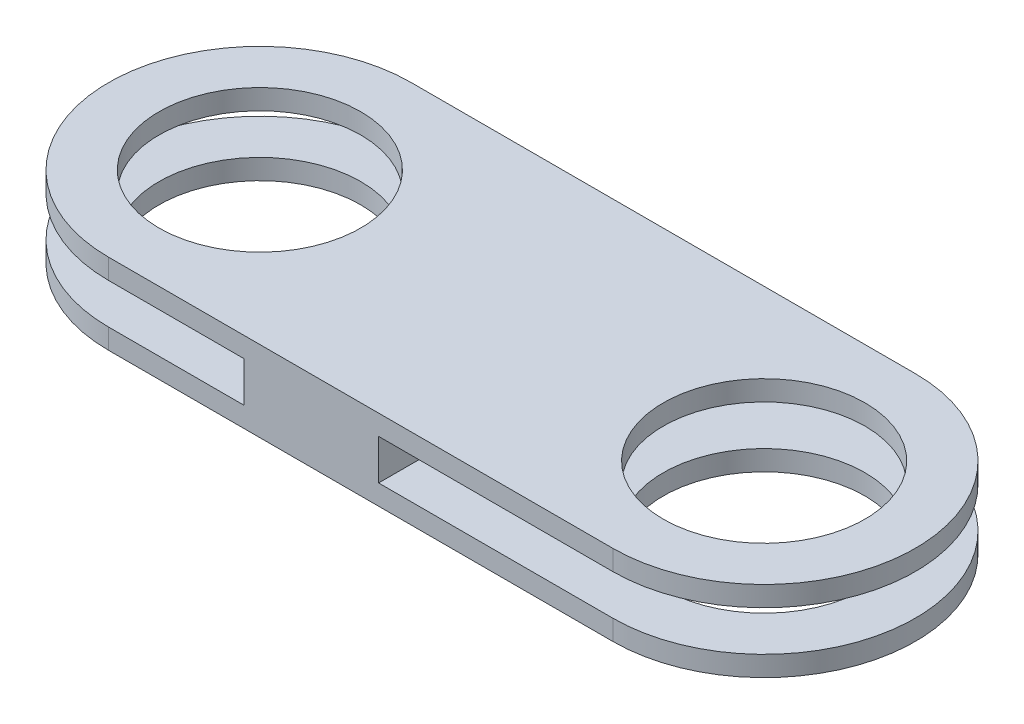
ISO-10303-21;
HEADER;
FILE_DESCRIPTION(('STEP AP214'),'2;1');
FILE_NAME('part.step','',(''),(''),'','','');
FILE_SCHEMA(('AUTOMOTIVE_DESIGN { 1 0 10303 214 1 1 1 1 }'));
ENDSEC;
DATA;
#1=APPLICATION_CONTEXT('core data for automotive mechanical design processes');
#2=APPLICATION_PROTOCOL_DEFINITION('international standard','automotive_design',2000,#1);
#3=PRODUCT_CONTEXT('',#1,'mechanical');
#4=PRODUCT('Part','Part','',(#3));
#5=PRODUCT_RELATED_PRODUCT_CATEGORY('part','',(#4));
#6=PRODUCT_DEFINITION_FORMATION('','',#4);
#7=PRODUCT_DEFINITION_CONTEXT('part definition',#1,'design');
#8=PRODUCT_DEFINITION('design','',#6,#7);
#9=PRODUCT_DEFINITION_SHAPE('','',#8);
#10=(LENGTH_UNIT() NAMED_UNIT(*) SI_UNIT(.MILLI.,.METRE.));
#11=(NAMED_UNIT(*) PLANE_ANGLE_UNIT() SI_UNIT($,.RADIAN.));
#12=(NAMED_UNIT(*) SI_UNIT($,.STERADIAN.) SOLID_ANGLE_UNIT());
#13=UNCERTAINTY_MEASURE_WITH_UNIT(LENGTH_MEASURE(1.E-05),#10,'distance_accuracy_value','');
#14=(GEOMETRIC_REPRESENTATION_CONTEXT(3) GLOBAL_UNCERTAINTY_ASSIGNED_CONTEXT((#13)) GLOBAL_UNIT_ASSIGNED_CONTEXT((#10,
#11,#12)) REPRESENTATION_CONTEXT('',''));
#15=CARTESIAN_POINT('',(0.,0.,0.));
#16=DIRECTION('',(0.,0.,1.));
#17=DIRECTION('',(1.,0.,0.));
#18=AXIS2_PLACEMENT_3D('',#15,#16,#17);
#19=CARTESIAN_POINT('',(0.,2.,0.));
#20=DIRECTION('',(0.,1.,0.));
#21=DIRECTION('',(0.,0.,1.));
#22=AXIS2_PLACEMENT_3D('',#19,#20,#21);
#23=PLANE('',#22);
#24=DIRECTION('',(0.,0.,-1.));
#25=VECTOR('',#24,1.);
#26=CARTESIAN_POINT('',(26.7759105212796,2.,-15.));
#27=LINE('',#26,#25);
#28=CARTESIAN_POINT('',(26.7759105212796,2.,15.));
#29=VERTEX_POINT('',#28);
#30=CARTESIAN_POINT('',(26.7759105212796,2.,-15.));
#31=VERTEX_POINT('',#30);
#32=EDGE_CURVE('E198',#29,#31,#27,.T.);
#33=ORIENTED_EDGE('',*,*,#32,.F.);
#34=DIRECTION('',(1.,0.,0.));
#35=VECTOR('',#34,1.);
#36=CARTESIAN_POINT('',(0.,2.,15.));
#37=LINE('',#36,#35);
#38=CARTESIAN_POINT('',(50.,2.,15.));
#39=VERTEX_POINT('',#38);
#40=EDGE_CURVE('E223',#29,#39,#37,.T.);
#41=ORIENTED_EDGE('',*,*,#40,.T.);
#42=CARTESIAN_POINT('',(50.,2.,0.));
#43=DIRECTION('',(0.,1.,0.));
#44=DIRECTION('',(0.,0.,1.));
#45=AXIS2_PLACEMENT_3D('',#42,#43,#44);
#46=CIRCLE('',#45,15.);
#47=CARTESIAN_POINT('',(50.,2.,-15.));
#48=VERTEX_POINT('',#47);
#49=EDGE_CURVE('E227',#39,#48,#46,.T.);
#50=ORIENTED_EDGE('',*,*,#49,.T.);
#51=DIRECTION('',(-1.,0.,0.));
#52=VECTOR('',#51,1.);
#53=CARTESIAN_POINT('',(0.,2.,-15.));
#54=LINE('',#53,#52);
#55=EDGE_CURVE('E63',#48,#31,#54,.T.);
#56=ORIENTED_EDGE('',*,*,#55,.T.);
#57=EDGE_LOOP('',(#33,#41,#50,#56));
#58=FACE_BOUND('',#57,.T.);
#59=CARTESIAN_POINT('',(50.,2.,0.));
#60=DIRECTION('',(0.,1.,0.));
#61=DIRECTION('',(0.,0.,1.));
#62=AXIS2_PLACEMENT_3D('',#59,#60,#61);
#63=CIRCLE('',#62,9.99999999999999);
#64=CARTESIAN_POINT('',(50.,2.,9.99999999999999));
#65=VERTEX_POINT('',#64);
#66=EDGE_CURVE('E214',#65,#65,#63,.T.);
#67=ORIENTED_EDGE('',*,*,#66,.F.);
#68=EDGE_LOOP('',(#67));
#69=FACE_BOUND('',#68,.T.);
#70=ADVANCED_FACE('F40',(#58,#69),#23,.T.);
#71=DIRECTION('',(0.,0.,1.));
#72=VECTOR('',#71,1.);
#73=CARTESIAN_POINT('',(13.4192062344069,2.,-15.));
#74=LINE('',#73,#72);
#75=CARTESIAN_POINT('',(13.4192062344069,2.,-15.));
#76=VERTEX_POINT('',#75);
#77=CARTESIAN_POINT('',(13.4192062344069,2.,15.));
#78=VERTEX_POINT('',#77);
#79=EDGE_CURVE('E55',#76,#78,#74,.T.);
#80=ORIENTED_EDGE('',*,*,#79,.F.);
#81=CARTESIAN_POINT('',(0.,2.,-15.));
#82=VERTEX_POINT('',#81);
#83=EDGE_CURVE('E229',#76,#82,#54,.T.);
#84=ORIENTED_EDGE('',*,*,#83,.T.);
#85=CARTESIAN_POINT('',(0.,2.,0.));
#86=DIRECTION('',(0.,1.,0.));
#87=DIRECTION('',(0.,0.,1.));
#88=AXIS2_PLACEMENT_3D('',#85,#86,#87);
#89=CIRCLE('',#88,15.);
#90=CARTESIAN_POINT('',(0.,2.,15.));
#91=VERTEX_POINT('',#90);
#92=EDGE_CURVE('E220',#82,#91,#89,.T.);
#93=ORIENTED_EDGE('',*,*,#92,.T.);
#94=EDGE_CURVE('E225',#91,#78,#37,.T.);
#95=ORIENTED_EDGE('',*,*,#94,.T.);
#96=EDGE_LOOP('',(#80,#84,#93,#95));
#97=FACE_BOUND('',#96,.T.);
#98=CARTESIAN_POINT('',(0.,2.,0.));
#99=DIRECTION('',(0.,1.,0.));
#100=DIRECTION('',(0.,0.,1.));
#101=AXIS2_PLACEMENT_3D('',#98,#99,#100);
#102=CIRCLE('',#101,10.);
#103=CARTESIAN_POINT('',(0.,2.,10.));
#104=VERTEX_POINT('',#103);
#105=EDGE_CURVE('E208',#104,#104,#102,.T.);
#106=ORIENTED_EDGE('',*,*,#105,.F.);
#107=EDGE_LOOP('',(#106));
#108=FACE_BOUND('',#107,.T.);
#109=ADVANCED_FACE('F262',(#97,#108),#23,.T.);
#110=CARTESIAN_POINT('',(0.,0.,0.));
#111=DIRECTION('',(0.,1.,0.));
#112=DIRECTION('',(0.,0.,1.));
#113=AXIS2_PLACEMENT_3D('',#110,#111,#112);
#114=PLANE('',#113);
#115=CARTESIAN_POINT('',(0.,0.,0.));
#116=DIRECTION('',(0.,1.,0.));
#117=DIRECTION('',(0.,0.,1.));
#118=AXIS2_PLACEMENT_3D('',#115,#116,#117);
#119=CIRCLE('',#118,15.);
#120=CARTESIAN_POINT('',(0.,0.,-15.));
#121=VERTEX_POINT('',#120);
#122=CARTESIAN_POINT('',(0.,0.,15.));
#123=VERTEX_POINT('',#122);
#124=EDGE_CURVE('E217',#121,#123,#119,.T.);
#125=ORIENTED_EDGE('',*,*,#124,.F.);
#126=DIRECTION('',(-1.,0.,0.));
#127=VECTOR('',#126,1.);
#128=CARTESIAN_POINT('',(0.,0.,-15.));
#129=LINE('',#128,#127);
#130=CARTESIAN_POINT('',(50.,0.,-15.));
#131=VERTEX_POINT('',#130);
#132=EDGE_CURVE('E224',#131,#121,#129,.T.);
#133=ORIENTED_EDGE('',*,*,#132,.F.);
#134=CARTESIAN_POINT('',(50.,0.,0.));
#135=DIRECTION('',(0.,1.,0.));
#136=DIRECTION('',(0.,0.,1.));
#137=AXIS2_PLACEMENT_3D('',#134,#135,#136);
#138=CIRCLE('',#137,15.);
#139=CARTESIAN_POINT('',(50.,0.,15.));
#140=VERTEX_POINT('',#139);
#141=EDGE_CURVE('E236',#140,#131,#138,.T.);
#142=ORIENTED_EDGE('',*,*,#141,.F.);
#143=DIRECTION('',(1.,0.,0.));
#144=VECTOR('',#143,1.);
#145=CARTESIAN_POINT('',(0.,0.,15.));
#146=LINE('',#145,#144);
#147=EDGE_CURVE('E234',#123,#140,#146,.T.);
#148=ORIENTED_EDGE('',*,*,#147,.F.);
#149=EDGE_LOOP('',(#125,#133,#142,#148));
#150=FACE_BOUND('',#149,.T.);
#151=CARTESIAN_POINT('',(50.,0.,0.));
#152=DIRECTION('',(0.,1.,0.));
#153=DIRECTION('',(0.,0.,1.));
#154=AXIS2_PLACEMENT_3D('',#151,#152,#153);
#155=CIRCLE('',#154,9.99999999999999);
#156=CARTESIAN_POINT('',(50.,0.,9.99999999999999));
#157=VERTEX_POINT('',#156);
#158=EDGE_CURVE('E211',#157,#157,#155,.T.);
#159=ORIENTED_EDGE('',*,*,#158,.T.);
#160=EDGE_LOOP('',(#159));
#161=FACE_BOUND('',#160,.T.);
#162=CARTESIAN_POINT('',(0.,0.,0.));
#163=DIRECTION('',(0.,1.,0.));
#164=DIRECTION('',(0.,0.,1.));
#165=AXIS2_PLACEMENT_3D('',#162,#163,#164);
#166=CIRCLE('',#165,10.);
#167=CARTESIAN_POINT('',(0.,0.,10.));
#168=VERTEX_POINT('',#167);
#169=EDGE_CURVE('E207',#168,#168,#166,.T.);
#170=ORIENTED_EDGE('',*,*,#169,.T.);
#171=EDGE_LOOP('',(#170));
#172=FACE_BOUND('',#171,.T.);
#173=ADVANCED_FACE('F254',(#150,#161,#172),#114,.F.);
#174=CARTESIAN_POINT('',(0.,2.,0.));
#175=DIRECTION('',(0.,-1.,0.));
#176=DIRECTION('',(0.,0.,-1.));
#177=AXIS2_PLACEMENT_3D('',#174,#175,#176);
#178=CYLINDRICAL_SURFACE('',#177,15.);
#179=ORIENTED_EDGE('',*,*,#124,.T.);
#180=DIRECTION('',(0.,-1.,0.));
#181=VECTOR('',#180,1.);
#182=CARTESIAN_POINT('',(0.,2.,15.));
#183=LINE('',#182,#181);
#184=EDGE_CURVE('E11',#91,#123,#183,.T.);
#185=ORIENTED_EDGE('',*,*,#184,.F.);
#186=ORIENTED_EDGE('',*,*,#92,.F.);
#187=DIRECTION('',(0.,-1.,0.));
#188=VECTOR('',#187,1.);
#189=CARTESIAN_POINT('',(0.,2.,-15.));
#190=LINE('',#189,#188);
#191=EDGE_CURVE('E231',#82,#121,#190,.T.);
#192=ORIENTED_EDGE('',*,*,#191,.T.);
#193=EDGE_LOOP('',(#179,#185,#186,#192));
#194=FACE_BOUND('',#193,.T.);
#195=ADVANCED_FACE('F42',(#194),#178,.T.);
#196=CARTESIAN_POINT('',(0.,2.,15.));
#197=DIRECTION('',(0.,0.,-1.));
#198=DIRECTION('',(-1.,0.,0.));
#199=AXIS2_PLACEMENT_3D('',#196,#197,#198);
#200=PLANE('',#199);
#201=ORIENTED_EDGE('',*,*,#147,.T.);
#202=DIRECTION('',(0.,-1.,0.));
#203=VECTOR('',#202,1.);
#204=CARTESIAN_POINT('',(50.,2.,15.));
#205=LINE('',#204,#203);
#206=EDGE_CURVE('E48',#39,#140,#205,.T.);
#207=ORIENTED_EDGE('',*,*,#206,.F.);
#208=ORIENTED_EDGE('',*,*,#40,.F.);
#209=DIRECTION('',(0.,-1.,0.));
#210=VECTOR('',#209,1.);
#211=CARTESIAN_POINT('',(26.7759105212796,4.,15.));
#212=LINE('',#211,#210);
#213=CARTESIAN_POINT('',(26.7759105212796,6.,15.));
#214=VERTEX_POINT('',#213);
#215=EDGE_CURVE('E137',#214,#29,#212,.T.);
#216=ORIENTED_EDGE('',*,*,#215,.F.);
#217=DIRECTION('',(1.,0.,0.));
#218=VECTOR('',#217,1.);
#219=CARTESIAN_POINT('',(0.,6.,15.));
#220=LINE('',#219,#218);
#221=CARTESIAN_POINT('',(50.,6.,15.));
#222=VERTEX_POINT('',#221);
#223=EDGE_CURVE('E148',#214,#222,#220,.T.);
#224=ORIENTED_EDGE('',*,*,#223,.T.);
#225=DIRECTION('',(0.,1.,0.));
#226=VECTOR('',#225,1.);
#227=CARTESIAN_POINT('',(50.,6.,15.));
#228=LINE('',#227,#226);
#229=CARTESIAN_POINT('',(50.,8.,15.));
#230=VERTEX_POINT('',#229);
#231=EDGE_CURVE('E195',#222,#230,#228,.T.);
#232=ORIENTED_EDGE('',*,*,#231,.T.);
#233=DIRECTION('',(1.,0.,0.));
#234=VECTOR('',#233,1.);
#235=CARTESIAN_POINT('',(0.,8.,15.));
#236=LINE('',#235,#234);
#237=CARTESIAN_POINT('',(0.,8.,15.));
#238=VERTEX_POINT('',#237);
#239=EDGE_CURVE('E184',#238,#230,#236,.T.);
#240=ORIENTED_EDGE('',*,*,#239,.F.);
#241=DIRECTION('',(0.,1.,0.));
#242=VECTOR('',#241,1.);
#243=CARTESIAN_POINT('',(0.,6.,15.));
#244=LINE('',#243,#242);
#245=CARTESIAN_POINT('',(0.,6.,15.));
#246=VERTEX_POINT('',#245);
#247=EDGE_CURVE('E143',#246,#238,#244,.T.);
#248=ORIENTED_EDGE('',*,*,#247,.F.);
#249=CARTESIAN_POINT('',(13.4192062344069,6.,15.));
#250=VERTEX_POINT('',#249);
#251=EDGE_CURVE('E140',#246,#250,#220,.T.);
#252=ORIENTED_EDGE('',*,*,#251,.T.);
#253=DIRECTION('',(0.,-1.,0.));
#254=VECTOR('',#253,1.);
#255=CARTESIAN_POINT('',(13.4192062344069,4.,15.));
#256=LINE('',#255,#254);
#257=EDGE_CURVE('E129',#250,#78,#256,.T.);
#258=ORIENTED_EDGE('',*,*,#257,.T.);
#259=ORIENTED_EDGE('',*,*,#94,.F.);
#260=ORIENTED_EDGE('',*,*,#184,.T.);
#261=EDGE_LOOP('',(#201,#207,#208,#216,#224,#232,#240,#248,#252,#258,#259,#260));
#262=FACE_BOUND('',#261,.T.);
#263=ADVANCED_FACE('F141',(#262),#200,.F.);
#264=CARTESIAN_POINT('',(50.,2.,0.));
#265=DIRECTION('',(0.,-1.,0.));
#266=DIRECTION('',(0.,0.,-1.));
#267=AXIS2_PLACEMENT_3D('',#264,#265,#266);
#268=CYLINDRICAL_SURFACE('',#267,15.);
#269=ORIENTED_EDGE('',*,*,#141,.T.);
#270=DIRECTION('',(0.,-1.,0.));
#271=VECTOR('',#270,1.);
#272=CARTESIAN_POINT('',(50.,2.,-15.));
#273=LINE('',#272,#271);
#274=EDGE_CURVE('E241',#48,#131,#273,.T.);
#275=ORIENTED_EDGE('',*,*,#274,.F.);
#276=ORIENTED_EDGE('',*,*,#49,.F.);
#277=ORIENTED_EDGE('',*,*,#206,.T.);
#278=EDGE_LOOP('',(#269,#275,#276,#277));
#279=FACE_BOUND('',#278,.T.);
#280=ADVANCED_FACE('F248',(#279),#268,.T.);
#281=CARTESIAN_POINT('',(0.,2.,-15.));
#282=DIRECTION('',(0.,0.,1.));
#283=DIRECTION('',(1.,0.,0.));
#284=AXIS2_PLACEMENT_3D('',#281,#282,#283);
#285=PLANE('',#284);
#286=ORIENTED_EDGE('',*,*,#132,.T.);
#287=ORIENTED_EDGE('',*,*,#191,.F.);
#288=ORIENTED_EDGE('',*,*,#83,.F.);
#289=DIRECTION('',(0.,-1.,0.));
#290=VECTOR('',#289,1.);
#291=CARTESIAN_POINT('',(13.4192062344069,4.,-15.));
#292=LINE('',#291,#290);
#293=CARTESIAN_POINT('',(13.4192062344069,6.,-15.));
#294=VERTEX_POINT('',#293);
#295=EDGE_CURVE('E136',#294,#76,#292,.T.);
#296=ORIENTED_EDGE('',*,*,#295,.F.);
#297=DIRECTION('',(-1.,0.,0.));
#298=VECTOR('',#297,1.);
#299=CARTESIAN_POINT('',(0.,6.,-15.));
#300=LINE('',#299,#298);
#301=CARTESIAN_POINT('',(0.,6.,-15.));
#302=VERTEX_POINT('',#301);
#303=EDGE_CURVE('E154',#294,#302,#300,.T.);
#304=ORIENTED_EDGE('',*,*,#303,.T.);
#305=DIRECTION('',(0.,1.,0.));
#306=VECTOR('',#305,1.);
#307=CARTESIAN_POINT('',(0.,6.,-15.));
#308=LINE('',#307,#306);
#309=CARTESIAN_POINT('',(0.,8.,-15.));
#310=VERTEX_POINT('',#309);
#311=EDGE_CURVE('E181',#302,#310,#308,.T.);
#312=ORIENTED_EDGE('',*,*,#311,.T.);
#313=DIRECTION('',(-1.,0.,0.));
#314=VECTOR('',#313,1.);
#315=CARTESIAN_POINT('',(0.,8.,-15.));
#316=LINE('',#315,#314);
#317=CARTESIAN_POINT('',(50.,8.,-15.));
#318=VERTEX_POINT('',#317);
#319=EDGE_CURVE('E174',#318,#310,#316,.T.);
#320=ORIENTED_EDGE('',*,*,#319,.F.);
#321=DIRECTION('',(0.,1.,0.));
#322=VECTOR('',#321,1.);
#323=CARTESIAN_POINT('',(50.,6.,-15.));
#324=LINE('',#323,#322);
#325=CARTESIAN_POINT('',(50.,6.,-15.));
#326=VERTEX_POINT('',#325);
#327=EDGE_CURVE('E193',#326,#318,#324,.T.);
#328=ORIENTED_EDGE('',*,*,#327,.F.);
#329=CARTESIAN_POINT('',(26.7759105212796,6.,-15.));
#330=VERTEX_POINT('',#329);
#331=EDGE_CURVE('E178',#326,#330,#300,.T.);
#332=ORIENTED_EDGE('',*,*,#331,.T.);
#333=DIRECTION('',(0.,-1.,0.));
#334=VECTOR('',#333,1.);
#335=CARTESIAN_POINT('',(26.7759105212796,4.,-15.));
#336=LINE('',#335,#334);
#337=EDGE_CURVE('E205',#330,#31,#336,.T.);
#338=ORIENTED_EDGE('',*,*,#337,.T.);
#339=ORIENTED_EDGE('',*,*,#55,.F.);
#340=ORIENTED_EDGE('',*,*,#274,.T.);
#341=EDGE_LOOP('',(#286,#287,#288,#296,#304,#312,#320,#328,#332,#338,#339,#340));
#342=FACE_BOUND('',#341,.T.);
#343=ADVANCED_FACE('F258',(#342),#285,.F.);
#344=CARTESIAN_POINT('',(50.,2.,0.));
#345=DIRECTION('',(0.,-1.,0.));
#346=DIRECTION('',(0.,0.,-1.));
#347=AXIS2_PLACEMENT_3D('',#344,#345,#346);
#348=CYLINDRICAL_SURFACE('',#347,9.99999999999999);
#349=ORIENTED_EDGE('',*,*,#66,.T.);
#350=EDGE_LOOP('',(#349));
#351=FACE_BOUND('',#350,.T.);
#352=ORIENTED_EDGE('',*,*,#158,.F.);
#353=EDGE_LOOP('',(#352));
#354=FACE_BOUND('',#353,.T.);
#355=ADVANCED_FACE('F289',(#351,#354),#348,.F.);
#356=CARTESIAN_POINT('',(0.,2.,0.));
#357=DIRECTION('',(0.,-1.,0.));
#358=DIRECTION('',(0.,0.,-1.));
#359=AXIS2_PLACEMENT_3D('',#356,#357,#358);
#360=CYLINDRICAL_SURFACE('',#359,10.);
#361=ORIENTED_EDGE('',*,*,#105,.T.);
#362=EDGE_LOOP('',(#361));
#363=FACE_BOUND('',#362,.T.);
#364=ORIENTED_EDGE('',*,*,#169,.F.);
#365=EDGE_LOOP('',(#364));
#366=FACE_BOUND('',#365,.T.);
#367=ADVANCED_FACE('F292',(#363,#366),#360,.F.);
#368=CARTESIAN_POINT('',(26.7759105212796,4.,-15.));
#369=DIRECTION('',(-1.,0.,0.));
#370=DIRECTION('',(0.,0.,1.));
#371=AXIS2_PLACEMENT_3D('',#368,#369,#370);
#372=PLANE('',#371);
#373=ORIENTED_EDGE('',*,*,#32,.T.);
#374=ORIENTED_EDGE('',*,*,#337,.F.);
#375=DIRECTION('',(0.,0.,-1.));
#376=VECTOR('',#375,1.);
#377=CARTESIAN_POINT('',(26.7759105212796,6.,-15.));
#378=LINE('',#377,#376);
#379=EDGE_CURVE('E156',#214,#330,#378,.T.);
#380=ORIENTED_EDGE('',*,*,#379,.F.);
#381=ORIENTED_EDGE('',*,*,#215,.T.);
#382=EDGE_LOOP('',(#373,#374,#380,#381));
#383=FACE_BOUND('',#382,.T.);
#384=ADVANCED_FACE('F283',(#383),#372,.F.);
#385=CARTESIAN_POINT('',(13.4192062344069,4.,-15.));
#386=DIRECTION('',(1.,0.,0.));
#387=DIRECTION('',(0.,0.,-1.));
#388=AXIS2_PLACEMENT_3D('',#385,#386,#387);
#389=PLANE('',#388);
#390=ORIENTED_EDGE('',*,*,#79,.T.);
#391=ORIENTED_EDGE('',*,*,#257,.F.);
#392=DIRECTION('',(0.,0.,1.));
#393=VECTOR('',#392,1.);
#394=CARTESIAN_POINT('',(13.4192062344069,6.,-15.));
#395=LINE('',#394,#393);
#396=EDGE_CURVE('E134',#294,#250,#395,.T.);
#397=ORIENTED_EDGE('',*,*,#396,.F.);
#398=ORIENTED_EDGE('',*,*,#295,.T.);
#399=EDGE_LOOP('',(#390,#391,#397,#398));
#400=FACE_BOUND('',#399,.T.);
#401=ADVANCED_FACE('F131',(#400),#389,.F.);
#402=CARTESIAN_POINT('',(0.,6.,0.));
#403=DIRECTION('',(0.,-1.,0.));
#404=DIRECTION('',(0.,0.,1.));
#405=AXIS2_PLACEMENT_3D('',#402,#403,#404);
#406=PLANE('',#405);
#407=ORIENTED_EDGE('',*,*,#379,.T.);
#408=ORIENTED_EDGE('',*,*,#331,.F.);
#409=CARTESIAN_POINT('',(50.,6.,0.));
#410=DIRECTION('',(0.,1.,0.));
#411=DIRECTION('',(0.,0.,1.));
#412=AXIS2_PLACEMENT_3D('',#409,#410,#411);
#413=CIRCLE('',#412,15.);
#414=EDGE_CURVE('E147',#222,#326,#413,.T.);
#415=ORIENTED_EDGE('',*,*,#414,.F.);
#416=ORIENTED_EDGE('',*,*,#223,.F.);
#417=EDGE_LOOP('',(#407,#408,#415,#416));
#418=FACE_BOUND('',#417,.T.);
#419=CARTESIAN_POINT('',(50.,6.,0.));
#420=DIRECTION('',(0.,1.,0.));
#421=DIRECTION('',(0.,0.,1.));
#422=AXIS2_PLACEMENT_3D('',#419,#420,#421);
#423=CIRCLE('',#422,9.99999999999999);
#424=CARTESIAN_POINT('',(50.,6.,9.99999999999999));
#425=VERTEX_POINT('',#424);
#426=EDGE_CURVE('E167',#425,#425,#423,.T.);
#427=ORIENTED_EDGE('',*,*,#426,.T.);
#428=EDGE_LOOP('',(#427));
#429=FACE_BOUND('',#428,.T.);
#430=ADVANCED_FACE('F279',(#418,#429),#406,.T.);
#431=ORIENTED_EDGE('',*,*,#396,.T.);
#432=ORIENTED_EDGE('',*,*,#251,.F.);
#433=CARTESIAN_POINT('',(0.,6.,0.));
#434=DIRECTION('',(0.,1.,0.));
#435=DIRECTION('',(0.,0.,1.));
#436=AXIS2_PLACEMENT_3D('',#433,#434,#435);
#437=CIRCLE('',#436,15.);
#438=EDGE_CURVE('E173',#302,#246,#437,.T.);
#439=ORIENTED_EDGE('',*,*,#438,.F.);
#440=ORIENTED_EDGE('',*,*,#303,.F.);
#441=EDGE_LOOP('',(#431,#432,#439,#440));
#442=FACE_BOUND('',#441,.T.);
#443=CARTESIAN_POINT('',(0.,6.,0.));
#444=DIRECTION('',(0.,1.,0.));
#445=DIRECTION('',(0.,0.,1.));
#446=AXIS2_PLACEMENT_3D('',#443,#444,#445);
#447=CIRCLE('',#446,10.);
#448=CARTESIAN_POINT('',(0.,6.,10.));
#449=VERTEX_POINT('',#448);
#450=EDGE_CURVE('E159',#449,#449,#447,.T.);
#451=ORIENTED_EDGE('',*,*,#450,.T.);
#452=EDGE_LOOP('',(#451));
#453=FACE_BOUND('',#452,.T.);
#454=ADVANCED_FACE('F151',(#442,#453),#406,.T.);
#455=CARTESIAN_POINT('',(0.,8.,0.));
#456=DIRECTION('',(0.,-1.,0.));
#457=DIRECTION('',(0.,0.,1.));
#458=AXIS2_PLACEMENT_3D('',#455,#456,#457);
#459=PLANE('',#458);
#460=CARTESIAN_POINT('',(0.,8.,0.));
#461=DIRECTION('',(0.,1.,0.));
#462=DIRECTION('',(0.,0.,1.));
#463=AXIS2_PLACEMENT_3D('',#460,#461,#462);
#464=CIRCLE('',#463,15.);
#465=EDGE_CURVE('E170',#310,#238,#464,.T.);
#466=ORIENTED_EDGE('',*,*,#465,.T.);
#467=ORIENTED_EDGE('',*,*,#239,.T.);
#468=CARTESIAN_POINT('',(50.,8.,0.));
#469=DIRECTION('',(0.,1.,0.));
#470=DIRECTION('',(0.,0.,1.));
#471=AXIS2_PLACEMENT_3D('',#468,#469,#470);
#472=CIRCLE('',#471,15.);
#473=EDGE_CURVE('E187',#230,#318,#472,.T.);
#474=ORIENTED_EDGE('',*,*,#473,.T.);
#475=ORIENTED_EDGE('',*,*,#319,.T.);
#476=EDGE_LOOP('',(#466,#467,#474,#475));
#477=FACE_BOUND('',#476,.T.);
#478=CARTESIAN_POINT('',(50.,8.,0.));
#479=DIRECTION('',(0.,1.,0.));
#480=DIRECTION('',(0.,0.,1.));
#481=AXIS2_PLACEMENT_3D('',#478,#479,#480);
#482=CIRCLE('',#481,9.99999999999999);
#483=CARTESIAN_POINT('',(50.,8.,9.99999999999999));
#484=VERTEX_POINT('',#483);
#485=EDGE_CURVE('E165',#484,#484,#482,.T.);
#486=ORIENTED_EDGE('',*,*,#485,.F.);
#487=EDGE_LOOP('',(#486));
#488=FACE_BOUND('',#487,.T.);
#489=CARTESIAN_POINT('',(0.,8.,0.));
#490=DIRECTION('',(0.,1.,0.));
#491=DIRECTION('',(0.,0.,1.));
#492=AXIS2_PLACEMENT_3D('',#489,#490,#491);
#493=CIRCLE('',#492,10.);
#494=CARTESIAN_POINT('',(0.,8.,10.));
#495=VERTEX_POINT('',#494);
#496=EDGE_CURVE('E155',#495,#495,#493,.T.);
#497=ORIENTED_EDGE('',*,*,#496,.F.);
#498=EDGE_LOOP('',(#497));
#499=FACE_BOUND('',#498,.T.);
#500=ADVANCED_FACE('F269',(#477,#488,#499),#459,.F.);
#501=CARTESIAN_POINT('',(0.,6.,0.));
#502=DIRECTION('',(0.,1.,0.));
#503=DIRECTION('',(0.,0.,-1.));
#504=AXIS2_PLACEMENT_3D('',#501,#502,#503);
#505=CYLINDRICAL_SURFACE('',#504,15.);
#506=ORIENTED_EDGE('',*,*,#465,.F.);
#507=ORIENTED_EDGE('',*,*,#311,.F.);
#508=ORIENTED_EDGE('',*,*,#438,.T.);
#509=ORIENTED_EDGE('',*,*,#247,.T.);
#510=EDGE_LOOP('',(#506,#507,#508,#509));
#511=FACE_BOUND('',#510,.T.);
#512=ADVANCED_FACE('F267',(#511),#505,.T.);
#513=CARTESIAN_POINT('',(50.,6.,0.));
#514=DIRECTION('',(0.,1.,0.));
#515=DIRECTION('',(0.,0.,-1.));
#516=AXIS2_PLACEMENT_3D('',#513,#514,#515);
#517=CYLINDRICAL_SURFACE('',#516,15.);
#518=ORIENTED_EDGE('',*,*,#473,.F.);
#519=ORIENTED_EDGE('',*,*,#231,.F.);
#520=ORIENTED_EDGE('',*,*,#414,.T.);
#521=ORIENTED_EDGE('',*,*,#327,.T.);
#522=EDGE_LOOP('',(#518,#519,#520,#521));
#523=FACE_BOUND('',#522,.T.);
#524=ADVANCED_FACE('F275',(#523),#517,.T.);
#525=CARTESIAN_POINT('',(50.,6.,0.));
#526=DIRECTION('',(0.,1.,0.));
#527=DIRECTION('',(0.,0.,-1.));
#528=AXIS2_PLACEMENT_3D('',#525,#526,#527);
#529=CYLINDRICAL_SURFACE('',#528,9.99999999999999);
#530=ORIENTED_EDGE('',*,*,#426,.F.);
#531=EDGE_LOOP('',(#530));
#532=FACE_BOUND('',#531,.T.);
#533=ORIENTED_EDGE('',*,*,#485,.T.);
#534=EDGE_LOOP('',(#533));
#535=FACE_BOUND('',#534,.T.);
#536=ADVANCED_FACE('F420',(#532,#535),#529,.F.);
#537=CARTESIAN_POINT('',(0.,6.,0.));
#538=DIRECTION('',(0.,1.,0.));
#539=DIRECTION('',(0.,0.,-1.));
#540=AXIS2_PLACEMENT_3D('',#537,#538,#539);
#541=CYLINDRICAL_SURFACE('',#540,10.);
#542=ORIENTED_EDGE('',*,*,#450,.F.);
#543=EDGE_LOOP('',(#542));
#544=FACE_BOUND('',#543,.T.);
#545=ORIENTED_EDGE('',*,*,#496,.T.);
#546=EDGE_LOOP('',(#545));
#547=FACE_BOUND('',#546,.T.);
#548=ADVANCED_FACE('F430',(#544,#547),#541,.F.);
#549=CLOSED_SHELL('',(#70,#109,#173,#195,#263,#280,#343,#355,#367,#384,#401,#430,#454,#500,#512,
#524,#536,#548));
#550=MANIFOLD_SOLID_BREP('B2',#549);
#551=ADVANCED_BREP_SHAPE_REPRESENTATION('',(#18,#550),#14);
#552=SHAPE_DEFINITION_REPRESENTATION(#9,#551);
ENDSEC;
END-ISO-10303-21;
